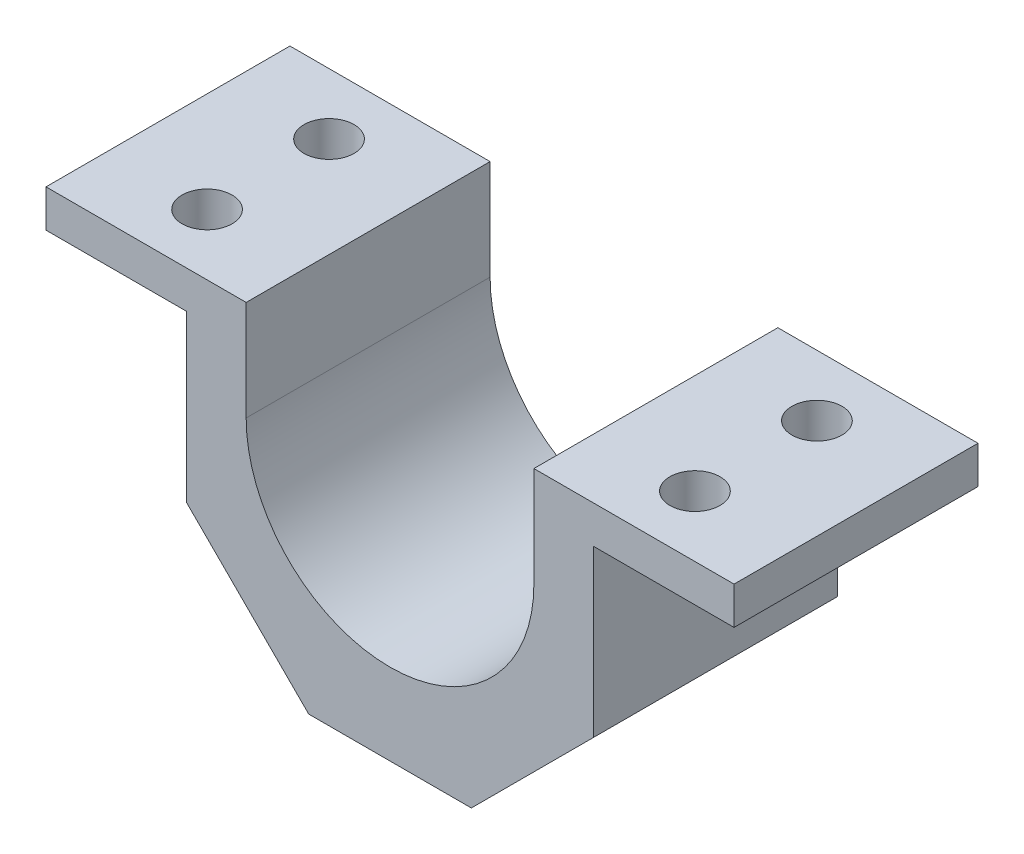
ISO-10303-21;
HEADER;
FILE_DESCRIPTION(('STEP AP214'),'2;1');
FILE_NAME('part.step','',(''),(''),'','','');
FILE_SCHEMA(('AUTOMOTIVE_DESIGN { 1 0 10303 214 1 1 1 1 }'));
ENDSEC;
DATA;
#1=APPLICATION_CONTEXT('core data for automotive mechanical design processes');
#2=APPLICATION_PROTOCOL_DEFINITION('international standard','automotive_design',2000,#1);
#3=PRODUCT_CONTEXT('',#1,'mechanical');
#4=PRODUCT('Part','Part','',(#3));
#5=PRODUCT_RELATED_PRODUCT_CATEGORY('part','',(#4));
#6=PRODUCT_DEFINITION_FORMATION('','',#4);
#7=PRODUCT_DEFINITION_CONTEXT('part definition',#1,'design');
#8=PRODUCT_DEFINITION('design','',#6,#7);
#9=PRODUCT_DEFINITION_SHAPE('','',#8);
#10=(LENGTH_UNIT() NAMED_UNIT(*) SI_UNIT(.MILLI.,.METRE.));
#11=(NAMED_UNIT(*) PLANE_ANGLE_UNIT() SI_UNIT($,.RADIAN.));
#12=(NAMED_UNIT(*) SI_UNIT($,.STERADIAN.) SOLID_ANGLE_UNIT());
#13=UNCERTAINTY_MEASURE_WITH_UNIT(LENGTH_MEASURE(1.E-05),#10,'distance_accuracy_value','');
#14=(GEOMETRIC_REPRESENTATION_CONTEXT(3) GLOBAL_UNCERTAINTY_ASSIGNED_CONTEXT((#13)) GLOBAL_UNIT_ASSIGNED_CONTEXT((#10,
#11,#12)) REPRESENTATION_CONTEXT('',''));
#15=CARTESIAN_POINT('',(0.,0.,0.));
#16=DIRECTION('',(0.,0.,1.));
#17=DIRECTION('',(1.,0.,0.));
#18=AXIS2_PLACEMENT_3D('',#15,#16,#17);
#19=CARTESIAN_POINT('',(-55.,16.,39.));
#20=DIRECTION('',(0.,-1.,0.));
#21=DIRECTION('',(0.,0.,-1.));
#22=AXIS2_PLACEMENT_3D('',#19,#20,#21);
#23=PLANE('',#22);
#24=CARTESIAN_POINT('',(-39.,16.,9.75));
#25=DIRECTION('',(0.,1.,0.));
#26=DIRECTION('',(0.,0.,1.));
#27=AXIS2_PLACEMENT_3D('',#24,#25,#26);
#28=CIRCLE('',#27,4.00000000000001);
#29=CARTESIAN_POINT('',(-39.,16.,13.75));
#30=VERTEX_POINT('',#29);
#31=EDGE_CURVE('E282',#30,#30,#28,.T.);
#32=ORIENTED_EDGE('',*,*,#31,.F.);
#33=EDGE_LOOP('',(#32));
#34=FACE_BOUND('',#33,.T.);
#35=DIRECTION('',(-1.,0.,0.));
#36=VECTOR('',#35,1.);
#37=CARTESIAN_POINT('',(-55.,16.,0.));
#38=LINE('',#37,#36);
#39=CARTESIAN_POINT('',(-23.,16.,0.));
#40=VERTEX_POINT('',#39);
#41=CARTESIAN_POINT('',(-55.,16.,0.));
#42=VERTEX_POINT('',#41);
#43=EDGE_CURVE('E182',#40,#42,#38,.T.);
#44=ORIENTED_EDGE('',*,*,#43,.T.);
#45=DIRECTION('',(0.,0.,-1.));
#46=VECTOR('',#45,1.);
#47=CARTESIAN_POINT('',(-55.,16.,39.));
#48=LINE('',#47,#46);
#49=CARTESIAN_POINT('',(-55.,16.,39.));
#50=VERTEX_POINT('',#49);
#51=EDGE_CURVE('E11',#50,#42,#48,.T.);
#52=ORIENTED_EDGE('',*,*,#51,.F.);
#53=DIRECTION('',(-1.,0.,0.));
#54=VECTOR('',#53,1.);
#55=CARTESIAN_POINT('',(-55.,16.,39.));
#56=LINE('',#55,#54);
#57=CARTESIAN_POINT('',(-23.,16.,39.));
#58=VERTEX_POINT('',#57);
#59=EDGE_CURVE('E222',#58,#50,#56,.T.);
#60=ORIENTED_EDGE('',*,*,#59,.F.);
#61=DIRECTION('',(0.,0.,-1.));
#62=VECTOR('',#61,1.);
#63=CARTESIAN_POINT('',(-23.,16.,39.));
#64=LINE('',#63,#62);
#65=EDGE_CURVE('E179',#58,#40,#64,.T.);
#66=ORIENTED_EDGE('',*,*,#65,.T.);
#67=EDGE_LOOP('',(#44,#52,#60,#66));
#68=FACE_BOUND('',#67,.T.);
#69=CARTESIAN_POINT('',(-39.,16.,29.25));
#70=DIRECTION('',(0.,1.,0.));
#71=DIRECTION('',(0.,0.,1.));
#72=AXIS2_PLACEMENT_3D('',#69,#70,#71);
#73=CIRCLE('',#72,4.00000000000001);
#74=CARTESIAN_POINT('',(-39.,16.,33.25));
#75=VERTEX_POINT('',#74);
#76=EDGE_CURVE('E352',#75,#75,#73,.F.);
#77=ORIENTED_EDGE('',*,*,#76,.T.);
#78=EDGE_LOOP('',(#77));
#79=FACE_BOUND('',#78,.T.);
#80=ADVANCED_FACE('F44',(#34,#68,#79),#23,.F.);
#81=CARTESIAN_POINT('',(-55.,10.,39.));
#82=DIRECTION('',(0.,1.,0.));
#83=DIRECTION('',(0.,0.,1.));
#84=AXIS2_PLACEMENT_3D('',#81,#82,#83);
#85=PLANE('',#84);
#86=CARTESIAN_POINT('',(-39.,10.,9.75));
#87=DIRECTION('',(0.,1.,0.));
#88=DIRECTION('',(0.,0.,1.));
#89=AXIS2_PLACEMENT_3D('',#86,#87,#88);
#90=CIRCLE('',#89,4.00000000000001);
#91=CARTESIAN_POINT('',(-39.,10.,13.75));
#92=VERTEX_POINT('',#91);
#93=EDGE_CURVE('E262',#92,#92,#90,.T.);
#94=ORIENTED_EDGE('',*,*,#93,.T.);
#95=EDGE_LOOP('',(#94));
#96=FACE_BOUND('',#95,.T.);
#97=DIRECTION('',(1.,0.,0.));
#98=VECTOR('',#97,1.);
#99=CARTESIAN_POINT('',(-55.,10.,0.));
#100=LINE('',#99,#98);
#101=CARTESIAN_POINT('',(-55.,10.,0.));
#102=VERTEX_POINT('',#101);
#103=CARTESIAN_POINT('',(-32.5,10.,0.));
#104=VERTEX_POINT('',#103);
#105=EDGE_CURVE('E192',#102,#104,#100,.T.);
#106=ORIENTED_EDGE('',*,*,#105,.T.);
#107=DIRECTION('',(0.,0.,-1.));
#108=VECTOR('',#107,1.);
#109=CARTESIAN_POINT('',(-32.5,10.,39.));
#110=LINE('',#109,#108);
#111=CARTESIAN_POINT('',(-32.5,10.,39.));
#112=VERTEX_POINT('',#111);
#113=EDGE_CURVE('E260',#112,#104,#110,.T.);
#114=ORIENTED_EDGE('',*,*,#113,.F.);
#115=DIRECTION('',(1.,0.,0.));
#116=VECTOR('',#115,1.);
#117=CARTESIAN_POINT('',(-55.,10.,39.));
#118=LINE('',#117,#116);
#119=CARTESIAN_POINT('',(-55.,10.,39.));
#120=VERTEX_POINT('',#119);
#121=EDGE_CURVE('E287',#120,#112,#118,.T.);
#122=ORIENTED_EDGE('',*,*,#121,.F.);
#123=DIRECTION('',(0.,0.,-1.));
#124=VECTOR('',#123,1.);
#125=CARTESIAN_POINT('',(-55.,10.,39.));
#126=LINE('',#125,#124);
#127=EDGE_CURVE('E54',#120,#102,#126,.T.);
#128=ORIENTED_EDGE('',*,*,#127,.T.);
#129=EDGE_LOOP('',(#106,#114,#122,#128));
#130=FACE_BOUND('',#129,.T.);
#131=CARTESIAN_POINT('',(-39.,10.,29.25));
#132=DIRECTION('',(0.,1.,0.));
#133=DIRECTION('',(0.,0.,1.));
#134=AXIS2_PLACEMENT_3D('',#131,#132,#133);
#135=CIRCLE('',#134,4.00000000000001);
#136=CARTESIAN_POINT('',(-39.,10.,33.25));
#137=VERTEX_POINT('',#136);
#138=EDGE_CURVE('E48',#137,#137,#135,.F.);
#139=ORIENTED_EDGE('',*,*,#138,.F.);
#140=EDGE_LOOP('',(#139));
#141=FACE_BOUND('',#140,.T.);
#142=ADVANCED_FACE('F341',(#96,#130,#141),#85,.F.);
#143=CARTESIAN_POINT('',(55.,10.,39.));
#144=DIRECTION('',(0.,1.,0.));
#145=DIRECTION('',(0.,0.,1.));
#146=AXIS2_PLACEMENT_3D('',#143,#144,#145);
#147=PLANE('',#146);
#148=CARTESIAN_POINT('',(39.,10.,29.25));
#149=DIRECTION('',(0.,1.,0.));
#150=DIRECTION('',(0.,0.,1.));
#151=AXIS2_PLACEMENT_3D('',#148,#149,#150);
#152=CIRCLE('',#151,4.00000000000001);
#153=CARTESIAN_POINT('',(39.,10.,33.25));
#154=VERTEX_POINT('',#153);
#155=EDGE_CURVE('E274',#154,#154,#152,.T.);
#156=ORIENTED_EDGE('',*,*,#155,.T.);
#157=EDGE_LOOP('',(#156));
#158=FACE_BOUND('',#157,.T.);
#159=DIRECTION('',(1.,0.,0.));
#160=VECTOR('',#159,1.);
#161=CARTESIAN_POINT('',(55.,10.,0.));
#162=LINE('',#161,#160);
#163=CARTESIAN_POINT('',(32.5,10.,0.));
#164=VERTEX_POINT('',#163);
#165=CARTESIAN_POINT('',(55.,10.,0.));
#166=VERTEX_POINT('',#165);
#167=EDGE_CURVE('E207',#164,#166,#162,.T.);
#168=ORIENTED_EDGE('',*,*,#167,.T.);
#169=DIRECTION('',(0.,0.,-1.));
#170=VECTOR('',#169,1.);
#171=CARTESIAN_POINT('',(55.,10.,39.));
#172=LINE('',#171,#170);
#173=CARTESIAN_POINT('',(55.,10.,39.));
#174=VERTEX_POINT('',#173);
#175=EDGE_CURVE('E234',#174,#166,#172,.T.);
#176=ORIENTED_EDGE('',*,*,#175,.F.);
#177=DIRECTION('',(1.,0.,0.));
#178=VECTOR('',#177,1.);
#179=CARTESIAN_POINT('',(55.,10.,39.));
#180=LINE('',#179,#178);
#181=CARTESIAN_POINT('',(32.5,10.,39.));
#182=VERTEX_POINT('',#181);
#183=EDGE_CURVE('E310',#182,#174,#180,.T.);
#184=ORIENTED_EDGE('',*,*,#183,.F.);
#185=DIRECTION('',(0.,0.,-1.));
#186=VECTOR('',#185,1.);
#187=CARTESIAN_POINT('',(32.5,10.,39.));
#188=LINE('',#187,#186);
#189=EDGE_CURVE('E236',#182,#164,#188,.T.);
#190=ORIENTED_EDGE('',*,*,#189,.T.);
#191=EDGE_LOOP('',(#168,#176,#184,#190));
#192=FACE_BOUND('',#191,.T.);
#193=CARTESIAN_POINT('',(39.,10.,9.75));
#194=DIRECTION('',(0.,1.,0.));
#195=DIRECTION('',(0.,0.,1.));
#196=AXIS2_PLACEMENT_3D('',#193,#194,#195);
#197=CIRCLE('',#196,4.00000000000001);
#198=CARTESIAN_POINT('',(39.,10.,13.75));
#199=VERTEX_POINT('',#198);
#200=EDGE_CURVE('E268',#199,#199,#197,.F.);
#201=ORIENTED_EDGE('',*,*,#200,.F.);
#202=EDGE_LOOP('',(#201));
#203=FACE_BOUND('',#202,.T.);
#204=ADVANCED_FACE('F350',(#158,#192,#203),#147,.F.);
#205=CARTESIAN_POINT('',(55.,16.,39.));
#206=DIRECTION('',(0.,-1.,0.));
#207=DIRECTION('',(0.,0.,-1.));
#208=AXIS2_PLACEMENT_3D('',#205,#206,#207);
#209=PLANE('',#208);
#210=CARTESIAN_POINT('',(39.,16.,29.25));
#211=DIRECTION('',(0.,1.,0.));
#212=DIRECTION('',(0.,0.,1.));
#213=AXIS2_PLACEMENT_3D('',#210,#211,#212);
#214=CIRCLE('',#213,4.00000000000001);
#215=CARTESIAN_POINT('',(39.,16.,33.25));
#216=VERTEX_POINT('',#215);
#217=EDGE_CURVE('E363',#216,#216,#214,.T.);
#218=ORIENTED_EDGE('',*,*,#217,.F.);
#219=EDGE_LOOP('',(#218));
#220=FACE_BOUND('',#219,.T.);
#221=DIRECTION('',(-1.,0.,0.));
#222=VECTOR('',#221,1.);
#223=CARTESIAN_POINT('',(55.,16.,0.));
#224=LINE('',#223,#222);
#225=CARTESIAN_POINT('',(55.,16.,0.));
#226=VERTEX_POINT('',#225);
#227=CARTESIAN_POINT('',(23.,16.,0.));
#228=VERTEX_POINT('',#227);
#229=EDGE_CURVE('E214',#226,#228,#224,.T.);
#230=ORIENTED_EDGE('',*,*,#229,.T.);
#231=DIRECTION('',(0.,0.,-1.));
#232=VECTOR('',#231,1.);
#233=CARTESIAN_POINT('',(23.,16.,39.));
#234=LINE('',#233,#232);
#235=CARTESIAN_POINT('',(23.,16.,39.));
#236=VERTEX_POINT('',#235);
#237=EDGE_CURVE('E171',#236,#228,#234,.T.);
#238=ORIENTED_EDGE('',*,*,#237,.F.);
#239=DIRECTION('',(-1.,0.,0.));
#240=VECTOR('',#239,1.);
#241=CARTESIAN_POINT('',(55.,16.,39.));
#242=LINE('',#241,#240);
#243=CARTESIAN_POINT('',(55.,16.,39.));
#244=VERTEX_POINT('',#243);
#245=EDGE_CURVE('E165',#244,#236,#242,.T.);
#246=ORIENTED_EDGE('',*,*,#245,.F.);
#247=DIRECTION('',(0.,0.,-1.));
#248=VECTOR('',#247,1.);
#249=CARTESIAN_POINT('',(55.,16.,39.));
#250=LINE('',#249,#248);
#251=EDGE_CURVE('E231',#244,#226,#250,.T.);
#252=ORIENTED_EDGE('',*,*,#251,.T.);
#253=EDGE_LOOP('',(#230,#238,#246,#252));
#254=FACE_BOUND('',#253,.T.);
#255=CARTESIAN_POINT('',(39.,16.,9.75));
#256=DIRECTION('',(0.,1.,0.));
#257=DIRECTION('',(0.,0.,1.));
#258=AXIS2_PLACEMENT_3D('',#255,#256,#257);
#259=CIRCLE('',#258,4.00000000000001);
#260=CARTESIAN_POINT('',(39.,16.,13.75));
#261=VERTEX_POINT('',#260);
#262=EDGE_CURVE('E358',#261,#261,#259,.F.);
#263=ORIENTED_EDGE('',*,*,#262,.T.);
#264=EDGE_LOOP('',(#263));
#265=FACE_BOUND('',#264,.T.);
#266=ADVANCED_FACE('F325',(#220,#254,#265),#209,.F.);
#267=CARTESIAN_POINT('',(-55.,16.,39.));
#268=DIRECTION('',(1.,0.,0.));
#269=DIRECTION('',(0.,0.,-1.));
#270=AXIS2_PLACEMENT_3D('',#267,#268,#269);
#271=PLANE('',#270);
#272=DIRECTION('',(0.,-1.,0.));
#273=VECTOR('',#272,1.);
#274=CARTESIAN_POINT('',(-55.,16.,0.));
#275=LINE('',#274,#273);
#276=EDGE_CURVE('E187',#42,#102,#275,.T.);
#277=ORIENTED_EDGE('',*,*,#276,.T.);
#278=ORIENTED_EDGE('',*,*,#127,.F.);
#279=DIRECTION('',(0.,-1.,0.));
#280=VECTOR('',#279,1.);
#281=CARTESIAN_POINT('',(-55.,16.,39.));
#282=LINE('',#281,#280);
#283=EDGE_CURVE('E124',#50,#120,#282,.T.);
#284=ORIENTED_EDGE('',*,*,#283,.F.);
#285=ORIENTED_EDGE('',*,*,#51,.T.);
#286=EDGE_LOOP('',(#277,#278,#284,#285));
#287=FACE_BOUND('',#286,.T.);
#288=ADVANCED_FACE('F374',(#287),#271,.F.);
#289=CARTESIAN_POINT('',(-32.5,10.,39.));
#290=DIRECTION('',(1.,0.,0.));
#291=DIRECTION('',(0.,0.,-1.));
#292=AXIS2_PLACEMENT_3D('',#289,#290,#291);
#293=PLANE('',#292);
#294=DIRECTION('',(0.,-1.,0.));
#295=VECTOR('',#294,1.);
#296=CARTESIAN_POINT('',(-32.5,10.,0.));
#297=LINE('',#296,#295);
#298=CARTESIAN_POINT('',(-32.5,-16.5000000000002,0.));
#299=VERTEX_POINT('',#298);
#300=EDGE_CURVE('E191',#104,#299,#297,.T.);
#301=ORIENTED_EDGE('',*,*,#300,.T.);
#302=DIRECTION('',(0.,0.,-1.));
#303=VECTOR('',#302,1.);
#304=CARTESIAN_POINT('',(-32.5,-16.5000000000002,39.));
#305=LINE('',#304,#303);
#306=CARTESIAN_POINT('',(-32.5,-16.5000000000002,39.));
#307=VERTEX_POINT('',#306);
#308=EDGE_CURVE('E254',#307,#299,#305,.T.);
#309=ORIENTED_EDGE('',*,*,#308,.F.);
#310=DIRECTION('',(0.,-1.,0.));
#311=VECTOR('',#310,1.);
#312=CARTESIAN_POINT('',(-32.5,10.,39.));
#313=LINE('',#312,#311);
#314=EDGE_CURVE('E295',#112,#307,#313,.T.);
#315=ORIENTED_EDGE('',*,*,#314,.F.);
#316=ORIENTED_EDGE('',*,*,#113,.T.);
#317=EDGE_LOOP('',(#301,#309,#315,#316));
#318=FACE_BOUND('',#317,.T.);
#319=ADVANCED_FACE('F379',(#318),#293,.F.);
#320=CARTESIAN_POINT('',(-32.5,-16.5000000000002,39.));
#321=DIRECTION('',(0.707106781186544,0.707106781186552,0.));
#322=DIRECTION('',(-0.707106781186552,0.707106781186544,0.));
#323=AXIS2_PLACEMENT_3D('',#320,#321,#322);
#324=PLANE('',#323);
#325=DIRECTION('',(0.707106781186552,-0.707106781186543,0.));
#326=VECTOR('',#325,1.);
#327=CARTESIAN_POINT('',(-32.5,-16.5000000000002,0.));
#328=LINE('',#327,#326);
#329=CARTESIAN_POINT('',(-13.,-36.,0.));
#330=VERTEX_POINT('',#329);
#331=EDGE_CURVE('E200',#299,#330,#328,.T.);
#332=ORIENTED_EDGE('',*,*,#331,.T.);
#333=DIRECTION('',(0.,0.,-1.));
#334=VECTOR('',#333,1.);
#335=CARTESIAN_POINT('',(-13.,-36.,39.));
#336=LINE('',#335,#334);
#337=CARTESIAN_POINT('',(-13.,-36.,39.));
#338=VERTEX_POINT('',#337);
#339=EDGE_CURVE('E253',#338,#330,#336,.T.);
#340=ORIENTED_EDGE('',*,*,#339,.F.);
#341=DIRECTION('',(0.707106781186552,-0.707106781186543,0.));
#342=VECTOR('',#341,1.);
#343=CARTESIAN_POINT('',(-32.5,-16.5000000000002,39.));
#344=LINE('',#343,#342);
#345=EDGE_CURVE('E293',#307,#338,#344,.T.);
#346=ORIENTED_EDGE('',*,*,#345,.F.);
#347=ORIENTED_EDGE('',*,*,#308,.T.);
#348=EDGE_LOOP('',(#332,#340,#346,#347));
#349=FACE_BOUND('',#348,.T.);
#350=ADVANCED_FACE('F396',(#349),#324,.F.);
#351=CARTESIAN_POINT('',(-13.,-36.,39.));
#352=DIRECTION('',(0.,1.,0.));
#353=DIRECTION('',(0.,0.,1.));
#354=AXIS2_PLACEMENT_3D('',#351,#352,#353);
#355=PLANE('',#354);
#356=DIRECTION('',(1.,0.,0.));
#357=VECTOR('',#356,1.);
#358=CARTESIAN_POINT('',(-13.,-36.,0.));
#359=LINE('',#358,#357);
#360=CARTESIAN_POINT('',(13.,-36.,0.));
#361=VERTEX_POINT('',#360);
#362=EDGE_CURVE('E199',#330,#361,#359,.T.);
#363=ORIENTED_EDGE('',*,*,#362,.T.);
#364=DIRECTION('',(0.,0.,-1.));
#365=VECTOR('',#364,1.);
#366=CARTESIAN_POINT('',(13.,-36.,39.));
#367=LINE('',#366,#365);
#368=CARTESIAN_POINT('',(13.,-36.,39.));
#369=VERTEX_POINT('',#368);
#370=EDGE_CURVE('E250',#369,#361,#367,.T.);
#371=ORIENTED_EDGE('',*,*,#370,.F.);
#372=DIRECTION('',(1.,0.,0.));
#373=VECTOR('',#372,1.);
#374=CARTESIAN_POINT('',(-13.,-36.,39.));
#375=LINE('',#374,#373);
#376=EDGE_CURVE('E296',#338,#369,#375,.T.);
#377=ORIENTED_EDGE('',*,*,#376,.F.);
#378=ORIENTED_EDGE('',*,*,#339,.T.);
#379=EDGE_LOOP('',(#363,#371,#377,#378));
#380=FACE_BOUND('',#379,.T.);
#381=ADVANCED_FACE('F395',(#380),#355,.F.);
#382=CARTESIAN_POINT('',(32.5,-16.5000000000002,39.));
#383=DIRECTION('',(-0.707106781186544,0.707106781186551,0.));
#384=DIRECTION('',(-0.707106781186551,-0.707106781186544,0.));
#385=AXIS2_PLACEMENT_3D('',#382,#383,#384);
#386=PLANE('',#385);
#387=DIRECTION('',(0.707106781186551,0.707106781186544,0.));
#388=VECTOR('',#387,1.);
#389=CARTESIAN_POINT('',(32.5,-16.5000000000002,0.));
#390=LINE('',#389,#388);
#391=CARTESIAN_POINT('',(32.5,-16.5000000000002,0.));
#392=VERTEX_POINT('',#391);
#393=EDGE_CURVE('E201',#361,#392,#390,.T.);
#394=ORIENTED_EDGE('',*,*,#393,.T.);
#395=DIRECTION('',(0.,0.,-1.));
#396=VECTOR('',#395,1.);
#397=CARTESIAN_POINT('',(32.5,-16.5000000000002,39.));
#398=LINE('',#397,#396);
#399=CARTESIAN_POINT('',(32.5,-16.5000000000002,39.));
#400=VERTEX_POINT('',#399);
#401=EDGE_CURVE('E241',#400,#392,#398,.T.);
#402=ORIENTED_EDGE('',*,*,#401,.F.);
#403=DIRECTION('',(0.707106781186551,0.707106781186544,0.));
#404=VECTOR('',#403,1.);
#405=CARTESIAN_POINT('',(32.5,-16.5000000000002,39.));
#406=LINE('',#405,#404);
#407=EDGE_CURVE('E303',#369,#400,#406,.T.);
#408=ORIENTED_EDGE('',*,*,#407,.F.);
#409=ORIENTED_EDGE('',*,*,#370,.T.);
#410=EDGE_LOOP('',(#394,#402,#408,#409));
#411=FACE_BOUND('',#410,.T.);
#412=ADVANCED_FACE('F389',(#411),#386,.F.);
#413=CARTESIAN_POINT('',(32.5,10.,39.));
#414=DIRECTION('',(-1.,0.,0.));
#415=DIRECTION('',(0.,-1.,0.));
#416=AXIS2_PLACEMENT_3D('',#413,#414,#415);
#417=PLANE('',#416);
#418=DIRECTION('',(0.,1.,0.));
#419=VECTOR('',#418,1.);
#420=CARTESIAN_POINT('',(32.5,10.,0.));
#421=LINE('',#420,#419);
#422=EDGE_CURVE('E208',#392,#164,#421,.T.);
#423=ORIENTED_EDGE('',*,*,#422,.T.);
#424=ORIENTED_EDGE('',*,*,#189,.F.);
#425=DIRECTION('',(0.,1.,0.));
#426=VECTOR('',#425,1.);
#427=CARTESIAN_POINT('',(32.5,10.,39.));
#428=LINE('',#427,#426);
#429=EDGE_CURVE('E305',#400,#182,#428,.T.);
#430=ORIENTED_EDGE('',*,*,#429,.F.);
#431=ORIENTED_EDGE('',*,*,#401,.T.);
#432=EDGE_LOOP('',(#423,#424,#430,#431));
#433=FACE_BOUND('',#432,.T.);
#434=ADVANCED_FACE('F388',(#433),#417,.F.);
#435=CARTESIAN_POINT('',(55.,16.,39.));
#436=DIRECTION('',(-1.,0.,0.));
#437=DIRECTION('',(0.,0.,1.));
#438=AXIS2_PLACEMENT_3D('',#435,#436,#437);
#439=PLANE('',#438);
#440=DIRECTION('',(0.,1.,0.));
#441=VECTOR('',#440,1.);
#442=CARTESIAN_POINT('',(55.,16.,0.));
#443=LINE('',#442,#441);
#444=EDGE_CURVE('E212',#166,#226,#443,.T.);
#445=ORIENTED_EDGE('',*,*,#444,.T.);
#446=ORIENTED_EDGE('',*,*,#251,.F.);
#447=DIRECTION('',(0.,1.,0.));
#448=VECTOR('',#447,1.);
#449=CARTESIAN_POINT('',(55.,16.,39.));
#450=LINE('',#449,#448);
#451=EDGE_CURVE('E307',#174,#244,#450,.T.);
#452=ORIENTED_EDGE('',*,*,#451,.F.);
#453=ORIENTED_EDGE('',*,*,#175,.T.);
#454=EDGE_LOOP('',(#445,#446,#452,#453));
#455=FACE_BOUND('',#454,.T.);
#456=ADVANCED_FACE('F318',(#455),#439,.F.);
#457=CARTESIAN_POINT('',(23.,16.,39.));
#458=DIRECTION('',(1.,0.,0.));
#459=DIRECTION('',(0.,1.,0.));
#460=AXIS2_PLACEMENT_3D('',#457,#458,#459);
#461=PLANE('',#460);
#462=DIRECTION('',(0.,-1.,0.));
#463=VECTOR('',#462,1.);
#464=CARTESIAN_POINT('',(23.,16.,0.));
#465=LINE('',#464,#463);
#466=CARTESIAN_POINT('',(23.,0.,0.));
#467=VERTEX_POINT('',#466);
#468=EDGE_CURVE('E173',#228,#467,#465,.T.);
#469=ORIENTED_EDGE('',*,*,#468,.T.);
#470=DIRECTION('',(0.,0.,-1.));
#471=VECTOR('',#470,1.);
#472=CARTESIAN_POINT('',(23.,0.,39.));
#473=LINE('',#472,#471);
#474=CARTESIAN_POINT('',(23.,0.,39.));
#475=VERTEX_POINT('',#474);
#476=EDGE_CURVE('E166',#475,#467,#473,.T.);
#477=ORIENTED_EDGE('',*,*,#476,.F.);
#478=DIRECTION('',(0.,-1.,0.));
#479=VECTOR('',#478,1.);
#480=CARTESIAN_POINT('',(23.,16.,39.));
#481=LINE('',#480,#479);
#482=EDGE_CURVE('E157',#236,#475,#481,.T.);
#483=ORIENTED_EDGE('',*,*,#482,.F.);
#484=ORIENTED_EDGE('',*,*,#237,.T.);
#485=EDGE_LOOP('',(#469,#477,#483,#484));
#486=FACE_BOUND('',#485,.T.);
#487=ADVANCED_FACE('F170',(#486),#461,.F.);
#488=CARTESIAN_POINT('',(0.,0.,39.));
#489=DIRECTION('',(0.,0.,-1.));
#490=DIRECTION('',(-1.,0.,0.));
#491=AXIS2_PLACEMENT_3D('',#488,#489,#490);
#492=CYLINDRICAL_SURFACE('',#491,23.);
#493=CARTESIAN_POINT('',(0.,0.,0.));
#494=DIRECTION('',(0.,0.,-1.));
#495=DIRECTION('',(1.,0.,0.));
#496=AXIS2_PLACEMENT_3D('',#493,#494,#495);
#497=CIRCLE('',#496,23.);
#498=CARTESIAN_POINT('',(-23.,0.,0.));
#499=VERTEX_POINT('',#498);
#500=EDGE_CURVE('E112',#467,#499,#497,.T.);
#501=ORIENTED_EDGE('',*,*,#500,.T.);
#502=DIRECTION('',(0.,0.,-1.));
#503=VECTOR('',#502,1.);
#504=CARTESIAN_POINT('',(-23.,0.,39.));
#505=LINE('',#504,#503);
#506=CARTESIAN_POINT('',(-23.,0.,39.));
#507=VERTEX_POINT('',#506);
#508=EDGE_CURVE('E174',#507,#499,#505,.T.);
#509=ORIENTED_EDGE('',*,*,#508,.F.);
#510=CARTESIAN_POINT('',(0.,0.,39.));
#511=DIRECTION('',(0.,0.,-1.));
#512=DIRECTION('',(1.,0.,0.));
#513=AXIS2_PLACEMENT_3D('',#510,#511,#512);
#514=CIRCLE('',#513,23.);
#515=EDGE_CURVE('E158',#475,#507,#514,.T.);
#516=ORIENTED_EDGE('',*,*,#515,.F.);
#517=ORIENTED_EDGE('',*,*,#476,.T.);
#518=EDGE_LOOP('',(#501,#509,#516,#517));
#519=FACE_BOUND('',#518,.T.);
#520=ADVANCED_FACE('F176',(#519),#492,.F.);
#521=CARTESIAN_POINT('',(-23.,16.,39.));
#522=DIRECTION('',(-1.,0.,0.));
#523=DIRECTION('',(0.,-1.,0.));
#524=AXIS2_PLACEMENT_3D('',#521,#522,#523);
#525=PLANE('',#524);
#526=DIRECTION('',(0.,1.,0.));
#527=VECTOR('',#526,1.);
#528=CARTESIAN_POINT('',(-23.,16.,0.));
#529=LINE('',#528,#527);
#530=EDGE_CURVE('E120',#499,#40,#529,.T.);
#531=ORIENTED_EDGE('',*,*,#530,.T.);
#532=ORIENTED_EDGE('',*,*,#65,.F.);
#533=DIRECTION('',(0.,1.,0.));
#534=VECTOR('',#533,1.);
#535=CARTESIAN_POINT('',(-23.,16.,39.));
#536=LINE('',#535,#534);
#537=EDGE_CURVE('E62',#507,#58,#536,.T.);
#538=ORIENTED_EDGE('',*,*,#537,.F.);
#539=ORIENTED_EDGE('',*,*,#508,.T.);
#540=EDGE_LOOP('',(#531,#532,#538,#539));
#541=FACE_BOUND('',#540,.T.);
#542=ADVANCED_FACE('F335',(#541),#525,.F.);
#543=CARTESIAN_POINT('',(0.,0.,39.));
#544=DIRECTION('',(0.,0.,1.));
#545=DIRECTION('',(1.,0.,0.));
#546=AXIS2_PLACEMENT_3D('',#543,#544,#545);
#547=PLANE('',#546);
#548=ORIENTED_EDGE('',*,*,#59,.T.);
#549=ORIENTED_EDGE('',*,*,#283,.T.);
#550=ORIENTED_EDGE('',*,*,#121,.T.);
#551=ORIENTED_EDGE('',*,*,#314,.T.);
#552=ORIENTED_EDGE('',*,*,#345,.T.);
#553=ORIENTED_EDGE('',*,*,#376,.T.);
#554=ORIENTED_EDGE('',*,*,#407,.T.);
#555=ORIENTED_EDGE('',*,*,#429,.T.);
#556=ORIENTED_EDGE('',*,*,#183,.T.);
#557=ORIENTED_EDGE('',*,*,#451,.T.);
#558=ORIENTED_EDGE('',*,*,#245,.T.);
#559=ORIENTED_EDGE('',*,*,#482,.T.);
#560=ORIENTED_EDGE('',*,*,#515,.T.);
#561=ORIENTED_EDGE('',*,*,#537,.T.);
#562=EDGE_LOOP('',(#548,#549,#550,#551,#552,#553,#554,#555,#556,#557,#558,#559,#560,#561));
#563=FACE_BOUND('',#562,.T.);
#564=ADVANCED_FACE('F156',(#563),#547,.T.);
#565=CARTESIAN_POINT('',(0.,0.,0.));
#566=DIRECTION('',(0.,0.,1.));
#567=DIRECTION('',(1.,0.,0.));
#568=AXIS2_PLACEMENT_3D('',#565,#566,#567);
#569=PLANE('',#568);
#570=ORIENTED_EDGE('',*,*,#43,.F.);
#571=ORIENTED_EDGE('',*,*,#530,.F.);
#572=ORIENTED_EDGE('',*,*,#500,.F.);
#573=ORIENTED_EDGE('',*,*,#468,.F.);
#574=ORIENTED_EDGE('',*,*,#229,.F.);
#575=ORIENTED_EDGE('',*,*,#444,.F.);
#576=ORIENTED_EDGE('',*,*,#167,.F.);
#577=ORIENTED_EDGE('',*,*,#422,.F.);
#578=ORIENTED_EDGE('',*,*,#393,.F.);
#579=ORIENTED_EDGE('',*,*,#362,.F.);
#580=ORIENTED_EDGE('',*,*,#331,.F.);
#581=ORIENTED_EDGE('',*,*,#300,.F.);
#582=ORIENTED_EDGE('',*,*,#105,.F.);
#583=ORIENTED_EDGE('',*,*,#276,.F.);
#584=EDGE_LOOP('',(#570,#571,#572,#573,#574,#575,#576,#577,#578,#579,#580,#581,#582,#583));
#585=FACE_BOUND('',#584,.T.);
#586=ADVANCED_FACE('F327',(#585),#569,.F.);
#587=CARTESIAN_POINT('',(39.,-23.,29.25));
#588=DIRECTION('',(0.,1.,0.));
#589=DIRECTION('',(0.,0.,1.));
#590=AXIS2_PLACEMENT_3D('',#587,#588,#589);
#591=CYLINDRICAL_SURFACE('',#590,4.00000000000001);
#592=ORIENTED_EDGE('',*,*,#217,.T.);
#593=EDGE_LOOP('',(#592));
#594=FACE_BOUND('',#593,.T.);
#595=ORIENTED_EDGE('',*,*,#155,.F.);
#596=EDGE_LOOP('',(#595));
#597=FACE_BOUND('',#596,.T.);
#598=ADVANCED_FACE('F368',(#594,#597),#591,.F.);
#599=CARTESIAN_POINT('',(39.,-23.,9.75));
#600=DIRECTION('',(0.,1.,0.));
#601=DIRECTION('',(0.,0.,1.));
#602=AXIS2_PLACEMENT_3D('',#599,#600,#601);
#603=CYLINDRICAL_SURFACE('',#602,4.00000000000001);
#604=ORIENTED_EDGE('',*,*,#262,.F.);
#605=EDGE_LOOP('',(#604));
#606=FACE_BOUND('',#605,.T.);
#607=ORIENTED_EDGE('',*,*,#200,.T.);
#608=EDGE_LOOP('',(#607));
#609=FACE_BOUND('',#608,.T.);
#610=ADVANCED_FACE('F438',(#606,#609),#603,.F.);
#611=CARTESIAN_POINT('',(-39.,-23.,9.75));
#612=DIRECTION('',(0.,1.,0.));
#613=DIRECTION('',(0.,0.,1.));
#614=AXIS2_PLACEMENT_3D('',#611,#612,#613);
#615=CYLINDRICAL_SURFACE('',#614,4.00000000000001);
#616=ORIENTED_EDGE('',*,*,#31,.T.);
#617=EDGE_LOOP('',(#616));
#618=FACE_BOUND('',#617,.T.);
#619=ORIENTED_EDGE('',*,*,#93,.F.);
#620=EDGE_LOOP('',(#619));
#621=FACE_BOUND('',#620,.T.);
#622=ADVANCED_FACE('F428',(#618,#621),#615,.F.);
#623=CARTESIAN_POINT('',(-39.,-23.,29.25));
#624=DIRECTION('',(0.,1.,0.));
#625=DIRECTION('',(0.,0.,1.));
#626=AXIS2_PLACEMENT_3D('',#623,#624,#625);
#627=CYLINDRICAL_SURFACE('',#626,4.00000000000001);
#628=ORIENTED_EDGE('',*,*,#76,.F.);
#629=EDGE_LOOP('',(#628));
#630=FACE_BOUND('',#629,.T.);
#631=ORIENTED_EDGE('',*,*,#138,.T.);
#632=EDGE_LOOP('',(#631));
#633=FACE_BOUND('',#632,.T.);
#634=ADVANCED_FACE('F426',(#630,#633),#627,.F.);
#635=CLOSED_SHELL('',(#80,#142,#204,#266,#288,#319,#350,#381,#412,#434,#456,#487,#520,#542,#564,
#586,#598,#610,#622,#634));
#636=MANIFOLD_SOLID_BREP('B2',#635);
#637=ADVANCED_BREP_SHAPE_REPRESENTATION('',(#18,#636),#14);
#638=SHAPE_DEFINITION_REPRESENTATION(#9,#637);
ENDSEC;
END-ISO-10303-21;
